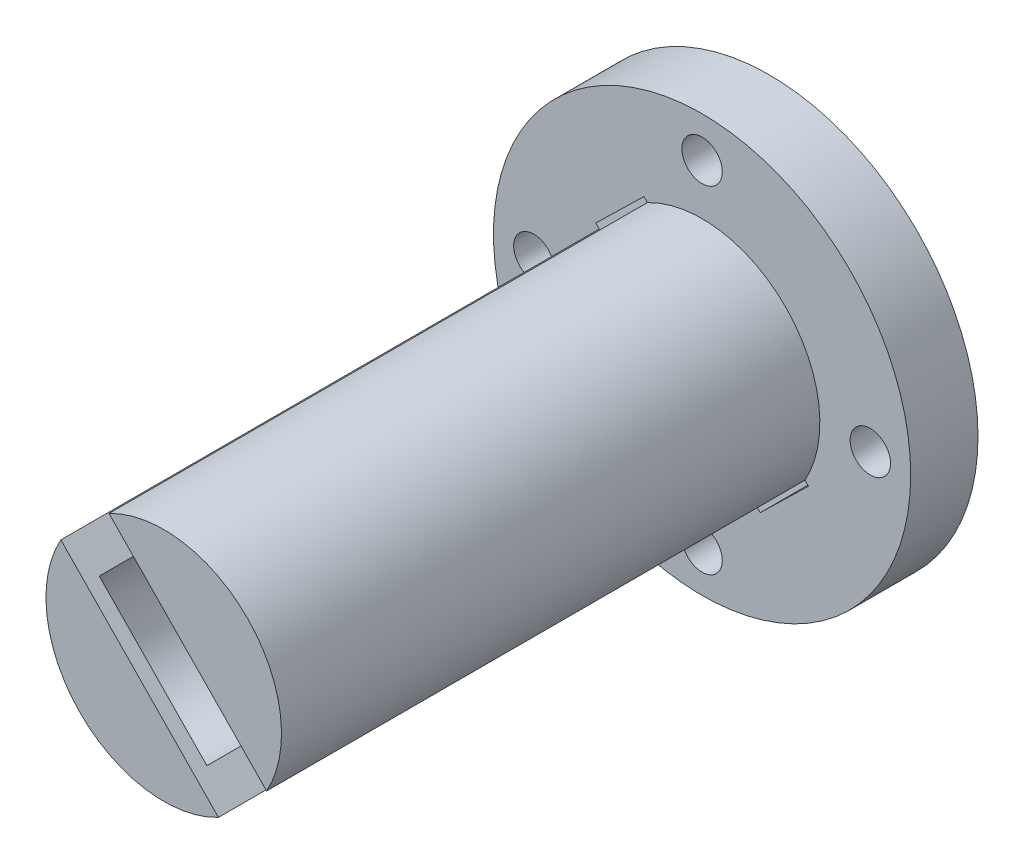
ISO-10303-21;
HEADER;
FILE_DESCRIPTION(('STEP AP214'),'2;1');
FILE_NAME('part.step','',(''),(''),'','','');
FILE_SCHEMA(('AUTOMOTIVE_DESIGN { 1 0 10303 214 1 1 1 1 }'));
ENDSEC;
DATA;
#1=APPLICATION_CONTEXT('core data for automotive mechanical design processes');
#2=APPLICATION_PROTOCOL_DEFINITION('international standard','automotive_design',2000,#1);
#3=PRODUCT_CONTEXT('',#1,'mechanical');
#4=PRODUCT('Part','Part','',(#3));
#5=PRODUCT_RELATED_PRODUCT_CATEGORY('part','',(#4));
#6=PRODUCT_DEFINITION_FORMATION('','',#4);
#7=PRODUCT_DEFINITION_CONTEXT('part definition',#1,'design');
#8=PRODUCT_DEFINITION('design','',#6,#7);
#9=PRODUCT_DEFINITION_SHAPE('','',#8);
#10=(LENGTH_UNIT() NAMED_UNIT(*) SI_UNIT(.MILLI.,.METRE.));
#11=(NAMED_UNIT(*) PLANE_ANGLE_UNIT() SI_UNIT($,.RADIAN.));
#12=(NAMED_UNIT(*) SI_UNIT($,.STERADIAN.) SOLID_ANGLE_UNIT());
#13=UNCERTAINTY_MEASURE_WITH_UNIT(LENGTH_MEASURE(1.E-05),#10,'distance_accuracy_value','');
#14=(GEOMETRIC_REPRESENTATION_CONTEXT(3) GLOBAL_UNCERTAINTY_ASSIGNED_CONTEXT((#13)) GLOBAL_UNIT_ASSIGNED_CONTEXT((#10,
#11,#12)) REPRESENTATION_CONTEXT('',''));
#15=CARTESIAN_POINT('',(0.,0.,0.));
#16=DIRECTION('',(0.,0.,1.));
#17=DIRECTION('',(1.,0.,0.));
#18=AXIS2_PLACEMENT_3D('',#15,#16,#17);
#19=CARTESIAN_POINT('',(0.,0.,10.));
#20=DIRECTION('',(0.,0.,1.));
#21=DIRECTION('',(1.,0.,0.));
#22=AXIS2_PLACEMENT_3D('',#19,#20,#21);
#23=PLANE('',#22);
#24=CARTESIAN_POINT('',(0.,-25.,10.));
#25=DIRECTION('',(0.,0.,1.));
#26=DIRECTION('',(1.,0.,0.));
#27=AXIS2_PLACEMENT_3D('',#24,#25,#26);
#28=CIRCLE('',#27,3.);
#29=CARTESIAN_POINT('',(3.,-25.,10.));
#30=VERTEX_POINT('',#29);
#31=EDGE_CURVE('E207',#30,#30,#28,.T.);
#32=ORIENTED_EDGE('',*,*,#31,.F.);
#33=EDGE_LOOP('',(#32));
#34=FACE_BOUND('',#33,.T.);
#35=CARTESIAN_POINT('',(-25.,0.,10.));
#36=DIRECTION('',(0.,0.,1.));
#37=DIRECTION('',(1.,0.,0.));
#38=AXIS2_PLACEMENT_3D('',#35,#36,#37);
#39=CIRCLE('',#38,3.);
#40=CARTESIAN_POINT('',(-22.,0.,10.));
#41=VERTEX_POINT('',#40);
#42=EDGE_CURVE('E214',#41,#41,#39,.T.);
#43=ORIENTED_EDGE('',*,*,#42,.F.);
#44=EDGE_LOOP('',(#43));
#45=FACE_BOUND('',#44,.T.);
#46=CARTESIAN_POINT('',(1.74574066942157E-13,25.,10.));
#47=DIRECTION('',(0.,0.,1.));
#48=DIRECTION('',(1.,0.,0.));
#49=AXIS2_PLACEMENT_3D('',#46,#47,#48);
#50=CIRCLE('',#49,3.);
#51=CARTESIAN_POINT('',(3.00000000000017,25.,10.));
#52=VERTEX_POINT('',#51);
#53=EDGE_CURVE('E220',#52,#52,#50,.T.);
#54=ORIENTED_EDGE('',*,*,#53,.F.);
#55=EDGE_LOOP('',(#54));
#56=FACE_BOUND('',#55,.T.);
#57=CARTESIAN_POINT('',(25.,-2.61861100413235E-13,10.));
#58=DIRECTION('',(0.,0.,1.));
#59=DIRECTION('',(1.,0.,0.));
#60=AXIS2_PLACEMENT_3D('',#57,#58,#59);
#61=CIRCLE('',#60,3.);
#62=CARTESIAN_POINT('',(28.,-2.61861100413235E-13,10.));
#63=VERTEX_POINT('',#62);
#64=EDGE_CURVE('E226',#63,#63,#61,.T.);
#65=ORIENTED_EDGE('',*,*,#64,.F.);
#66=EDGE_LOOP('',(#65));
#67=FACE_BOUND('',#66,.T.);
#68=CARTESIAN_POINT('',(0.,0.,10.));
#69=DIRECTION('',(0.,0.,1.));
#70=DIRECTION('',(1.,0.,0.));
#71=AXIS2_PLACEMENT_3D('',#68,#69,#70);
#72=CIRCLE('',#71,31.);
#73=CARTESIAN_POINT('',(31.,0.,10.));
#74=VERTEX_POINT('',#73);
#75=EDGE_CURVE('E232',#74,#74,#72,.T.);
#76=ORIENTED_EDGE('',*,*,#75,.T.);
#77=EDGE_LOOP('',(#76));
#78=FACE_BOUND('',#77,.T.);
#79=DIRECTION('',(-0.715850446822266,-0.69825363427938,0.));
#80=VECTOR('',#79,1.);
#81=CARTESIAN_POINT('',(-12.2194385998892,12.5273828193897,10.));
#82=LINE('',#81,#80);
#83=CARTESIAN_POINT('',(-8.64018636577786,16.0186509907866,10.));
#84=VERTEX_POINT('',#83);
#85=CARTESIAN_POINT('',(-15.7986908340005,9.03611464799276,10.));
#86=VERTEX_POINT('',#85);
#87=EDGE_CURVE('E189',#84,#86,#82,.T.);
#88=ORIENTED_EDGE('',*,*,#87,.F.);
#89=DIRECTION('',(0.698253634279381,-0.715850446822265,0.));
#90=VECTOR('',#89,1.);
#91=CARTESIAN_POINT('',(3.57925223411133,3.4912681713969,10.));
#92=LINE('',#91,#90);
#93=CARTESIAN_POINT('',(-8.13081720427597,15.4964451275333,9.99999999999999));
#94=VERTEX_POINT('',#93);
#95=EDGE_CURVE('E188',#84,#94,#92,.T.);
#96=ORIENTED_EDGE('',*,*,#95,.T.);
#97=CARTESIAN_POINT('',(0.,0.,9.99999999999999));
#98=DIRECTION('',(0.,0.,1.));
#99=DIRECTION('',(1.,0.,0.));
#100=AXIS2_PLACEMENT_3D('',#97,#98,#99);
#101=CIRCLE('',#100,17.5);
#102=CARTESIAN_POINT('',(15.2893216724986,-8.51390878473947,9.99999999999999));
#103=VERTEX_POINT('',#102);
#104=EDGE_CURVE('E203',#94,#103,#101,.F.);
#105=ORIENTED_EDGE('',*,*,#104,.T.);
#106=CARTESIAN_POINT('',(15.7986908340005,-9.03611464799273,10.));
#107=VERTEX_POINT('',#106);
#108=EDGE_CURVE('E186',#103,#107,#92,.T.);
#109=ORIENTED_EDGE('',*,*,#108,.T.);
#110=DIRECTION('',(-0.715850446822265,-0.698253634279381,0.));
#111=VECTOR('',#110,1.);
#112=CARTESIAN_POINT('',(12.2194385998892,-12.5273828193896,10.));
#113=LINE('',#112,#111);
#114=CARTESIAN_POINT('',(8.64018636577783,-16.0186509907865,10.));
#115=VERTEX_POINT('',#114);
#116=EDGE_CURVE('E131',#107,#115,#113,.T.);
#117=ORIENTED_EDGE('',*,*,#116,.T.);
#118=DIRECTION('',(0.698253634279381,-0.715850446822265,0.));
#119=VECTOR('',#118,1.);
#120=CARTESIAN_POINT('',(-3.57925223411133,-3.4912681713969,10.));
#121=LINE('',#120,#119);
#122=CARTESIAN_POINT('',(8.13081720427597,-15.4964451275333,9.99999999999999));
#123=VERTEX_POINT('',#122);
#124=EDGE_CURVE('E171',#123,#115,#121,.T.);
#125=ORIENTED_EDGE('',*,*,#124,.F.);
#126=CARTESIAN_POINT('',(-15.2893216724986,8.51390878473947,9.99999999999999));
#127=VERTEX_POINT('',#126);
#128=EDGE_CURVE('E206',#123,#127,#101,.F.);
#129=ORIENTED_EDGE('',*,*,#128,.T.);
#130=EDGE_CURVE('E174',#86,#127,#121,.T.);
#131=ORIENTED_EDGE('',*,*,#130,.F.);
#132=EDGE_LOOP('',(#88,#96,#105,#109,#117,#125,#129,#131));
#133=FACE_BOUND('',#132,.T.);
#134=ADVANCED_FACE('F37',(#34,#45,#56,#67,#78,#133),#23,.T.);
#135=CARTESIAN_POINT('',(0.,0.,0.));
#136=DIRECTION('',(0.,0.,1.));
#137=DIRECTION('',(1.,0.,0.));
#138=AXIS2_PLACEMENT_3D('',#135,#136,#137);
#139=PLANE('',#138);
#140=CARTESIAN_POINT('',(0.,-25.,0.));
#141=DIRECTION('',(0.,0.,1.));
#142=DIRECTION('',(1.,0.,0.));
#143=AXIS2_PLACEMENT_3D('',#140,#141,#142);
#144=CIRCLE('',#143,3.);
#145=CARTESIAN_POINT('',(3.,-25.,0.));
#146=VERTEX_POINT('',#145);
#147=EDGE_CURVE('E211',#146,#146,#144,.T.);
#148=ORIENTED_EDGE('',*,*,#147,.T.);
#149=EDGE_LOOP('',(#148));
#150=FACE_BOUND('',#149,.T.);
#151=CARTESIAN_POINT('',(-25.,0.,0.));
#152=DIRECTION('',(0.,0.,1.));
#153=DIRECTION('',(1.,0.,0.));
#154=AXIS2_PLACEMENT_3D('',#151,#152,#153);
#155=CIRCLE('',#154,3.);
#156=CARTESIAN_POINT('',(-22.,0.,0.));
#157=VERTEX_POINT('',#156);
#158=EDGE_CURVE('E217',#157,#157,#155,.T.);
#159=ORIENTED_EDGE('',*,*,#158,.T.);
#160=EDGE_LOOP('',(#159));
#161=FACE_BOUND('',#160,.T.);
#162=CARTESIAN_POINT('',(1.74574066942157E-13,25.,0.));
#163=DIRECTION('',(0.,0.,1.));
#164=DIRECTION('',(1.,0.,0.));
#165=AXIS2_PLACEMENT_3D('',#162,#163,#164);
#166=CIRCLE('',#165,3.);
#167=CARTESIAN_POINT('',(3.00000000000017,25.,0.));
#168=VERTEX_POINT('',#167);
#169=EDGE_CURVE('E223',#168,#168,#166,.T.);
#170=ORIENTED_EDGE('',*,*,#169,.T.);
#171=EDGE_LOOP('',(#170));
#172=FACE_BOUND('',#171,.T.);
#173=CARTESIAN_POINT('',(25.,-2.61861100413235E-13,0.));
#174=DIRECTION('',(0.,0.,1.));
#175=DIRECTION('',(1.,0.,0.));
#176=AXIS2_PLACEMENT_3D('',#173,#174,#175);
#177=CIRCLE('',#176,3.);
#178=CARTESIAN_POINT('',(28.,-2.61861100413235E-13,0.));
#179=VERTEX_POINT('',#178);
#180=EDGE_CURVE('E229',#179,#179,#177,.T.);
#181=ORIENTED_EDGE('',*,*,#180,.T.);
#182=EDGE_LOOP('',(#181));
#183=FACE_BOUND('',#182,.T.);
#184=CARTESIAN_POINT('',(0.,0.,0.));
#185=DIRECTION('',(0.,0.,1.));
#186=DIRECTION('',(1.,0.,0.));
#187=AXIS2_PLACEMENT_3D('',#184,#185,#186);
#188=CIRCLE('',#187,31.);
#189=CARTESIAN_POINT('',(31.,0.,0.));
#190=VERTEX_POINT('',#189);
#191=EDGE_CURVE('E210',#190,#190,#188,.T.);
#192=ORIENTED_EDGE('',*,*,#191,.F.);
#193=EDGE_LOOP('',(#192));
#194=FACE_BOUND('',#193,.T.);
#195=DIRECTION('',(-0.698253634279381,0.715850446822265,0.));
#196=VECTOR('',#195,1.);
#197=CARTESIAN_POINT('',(15.7986908340005,-9.03611464799273,0.));
#198=LINE('',#197,#196);
#199=CARTESIAN_POINT('',(-4.42024809929686,11.6923653184744,0.));
#200=VERTEX_POINT('',#199);
#201=CARTESIAN_POINT('',(-8.64018636577786,16.0186509907866,0.));
#202=VERTEX_POINT('',#201);
#203=EDGE_CURVE('E145',#200,#202,#198,.T.);
#204=ORIENTED_EDGE('',*,*,#203,.T.);
#205=DIRECTION('',(0.715850446822266,0.69825363427938,0.));
#206=VECTOR('',#205,1.);
#207=CARTESIAN_POINT('',(-15.7986908340005,9.03611464799276,0.));
#208=LINE('',#207,#206);
#209=CARTESIAN_POINT('',(-15.7986908340005,9.03611464799276,0.));
#210=VERTEX_POINT('',#209);
#211=EDGE_CURVE('E144',#210,#202,#208,.T.);
#212=ORIENTED_EDGE('',*,*,#211,.F.);
#213=DIRECTION('',(-0.698253634279381,0.715850446822265,0.));
#214=VECTOR('',#213,1.);
#215=CARTESIAN_POINT('',(8.64018636577783,-16.0186509907865,0.));
#216=LINE('',#215,#214);
#217=CARTESIAN_POINT('',(-11.5787525675195,4.70982897568057,0.));
#218=VERTEX_POINT('',#217);
#219=EDGE_CURVE('E155',#218,#210,#216,.T.);
#220=ORIENTED_EDGE('',*,*,#219,.F.);
#221=CARTESIAN_POINT('',(0.,0.,0.));
#222=DIRECTION('',(0.,0.,1.));
#223=DIRECTION('',(1.,0.,0.));
#224=AXIS2_PLACEMENT_3D('',#221,#222,#223);
#225=CIRCLE('',#224,12.5);
#226=CARTESIAN_POINT('',(4.42024809929686,-11.6923653184744,0.));
#227=VERTEX_POINT('',#226);
#228=EDGE_CURVE('E197',#218,#227,#225,.T.);
#229=ORIENTED_EDGE('',*,*,#228,.T.);
#230=CARTESIAN_POINT('',(8.64018636577783,-16.0186509907865,0.));
#231=VERTEX_POINT('',#230);
#232=EDGE_CURVE('E150',#231,#227,#216,.T.);
#233=ORIENTED_EDGE('',*,*,#232,.F.);
#234=DIRECTION('',(0.715850446822265,0.698253634279381,0.));
#235=VECTOR('',#234,1.);
#236=CARTESIAN_POINT('',(8.64018636577783,-16.0186509907865,0.));
#237=LINE('',#236,#235);
#238=CARTESIAN_POINT('',(15.7986908340005,-9.03611464799273,0.));
#239=VERTEX_POINT('',#238);
#240=EDGE_CURVE('E129',#231,#239,#237,.T.);
#241=ORIENTED_EDGE('',*,*,#240,.T.);
#242=CARTESIAN_POINT('',(11.5787525675195,-4.70982897568057,0.));
#243=VERTEX_POINT('',#242);
#244=EDGE_CURVE('E137',#239,#243,#198,.T.);
#245=ORIENTED_EDGE('',*,*,#244,.T.);
#246=EDGE_CURVE('E192',#243,#200,#225,.T.);
#247=ORIENTED_EDGE('',*,*,#246,.T.);
#248=EDGE_LOOP('',(#204,#212,#220,#229,#233,#241,#245,#247));
#249=FACE_BOUND('',#248,.T.);
#250=ADVANCED_FACE('F148',(#150,#161,#172,#183,#194,#249),#139,.F.);
#251=CARTESIAN_POINT('',(0.,0.,90.));
#252=DIRECTION('',(0.,0.,-1.));
#253=DIRECTION('',(-1.,0.,0.));
#254=AXIS2_PLACEMENT_3D('',#251,#252,#253);
#255=CYLINDRICAL_SURFACE('',#254,17.5);
#256=DIRECTION('',(0.,0.,-1.));
#257=VECTOR('',#256,1.);
#258=CARTESIAN_POINT('',(-8.13081720427597,15.4964451275333,90.));
#259=LINE('',#258,#257);
#260=CARTESIAN_POINT('',(-8.13081720427598,15.4964451275333,90.));
#261=VERTEX_POINT('',#260);
#262=EDGE_CURVE('E184',#261,#94,#259,.T.);
#263=ORIENTED_EDGE('',*,*,#262,.F.);
#264=CARTESIAN_POINT('',(0.,0.,90.));
#265=DIRECTION('',(0.,0.,1.));
#266=DIRECTION('',(1.,0.,0.));
#267=AXIS2_PLACEMENT_3D('',#264,#265,#266);
#268=CIRCLE('',#267,17.5);
#269=CARTESIAN_POINT('',(15.2893216724986,-8.51390878473947,90.));
#270=VERTEX_POINT('',#269);
#271=EDGE_CURVE('E199',#270,#261,#268,.T.);
#272=ORIENTED_EDGE('',*,*,#271,.F.);
#273=DIRECTION('',(0.,0.,-1.));
#274=VECTOR('',#273,1.);
#275=CARTESIAN_POINT('',(15.2893216724986,-8.51390878473947,90.));
#276=LINE('',#275,#274);
#277=EDGE_CURVE('E182',#103,#270,#276,.F.);
#278=ORIENTED_EDGE('',*,*,#277,.F.);
#279=ORIENTED_EDGE('',*,*,#104,.F.);
#280=EDGE_LOOP('',(#263,#272,#278,#279));
#281=FACE_BOUND('',#280,.T.);
#282=ADVANCED_FACE('F276',(#281),#255,.T.);
#283=CARTESIAN_POINT('',(0.,0.,90.));
#284=DIRECTION('',(0.,0.,1.));
#285=DIRECTION('',(1.,0.,0.));
#286=AXIS2_PLACEMENT_3D('',#283,#284,#285);
#287=PLANE('',#286);
#288=ORIENTED_EDGE('',*,*,#271,.T.);
#289=DIRECTION('',(0.698253634279381,-0.715850446822265,0.));
#290=VECTOR('',#289,1.);
#291=CARTESIAN_POINT('',(3.57925223411133,3.4912681713969,90.));
#292=LINE('',#291,#290);
#293=EDGE_CURVE('E179',#261,#270,#292,.T.);
#294=ORIENTED_EDGE('',*,*,#293,.T.);
#295=EDGE_LOOP('',(#288,#294));
#296=FACE_BOUND('',#295,.T.);
#297=ADVANCED_FACE('F267',(#296),#287,.T.);
#298=CARTESIAN_POINT('',(0.,0.,88.));
#299=DIRECTION('',(0.,0.,-1.));
#300=DIRECTION('',(-1.,0.,0.));
#301=AXIS2_PLACEMENT_3D('',#298,#299,#300);
#302=CYLINDRICAL_SURFACE('',#301,12.5);
#303=CARTESIAN_POINT('',(0.,0.,88.));
#304=DIRECTION('',(0.,0.,1.));
#305=DIRECTION('',(1.,0.,0.));
#306=AXIS2_PLACEMENT_3D('',#303,#304,#305);
#307=CIRCLE('',#306,12.5);
#308=CARTESIAN_POINT('',(11.5787525675195,-4.70982897568057,88.));
#309=VERTEX_POINT('',#308);
#310=CARTESIAN_POINT('',(-4.42024809929686,11.6923653184744,88.));
#311=VERTEX_POINT('',#310);
#312=EDGE_CURVE('E193',#309,#311,#307,.T.);
#313=ORIENTED_EDGE('',*,*,#312,.T.);
#314=DIRECTION('',(0.,0.,-1.));
#315=VECTOR('',#314,1.);
#316=CARTESIAN_POINT('',(-4.42024809929686,11.6923653184744,88.));
#317=LINE('',#316,#315);
#318=EDGE_CURVE('E176',#311,#200,#317,.T.);
#319=ORIENTED_EDGE('',*,*,#318,.T.);
#320=ORIENTED_EDGE('',*,*,#246,.F.);
#321=DIRECTION('',(0.,0.,-1.));
#322=VECTOR('',#321,1.);
#323=CARTESIAN_POINT('',(11.5787525675195,-4.70982897568057,88.));
#324=LINE('',#323,#322);
#325=EDGE_CURVE('E140',#243,#309,#324,.F.);
#326=ORIENTED_EDGE('',*,*,#325,.T.);
#327=EDGE_LOOP('',(#313,#319,#320,#326));
#328=FACE_BOUND('',#327,.T.);
#329=ADVANCED_FACE('F273',(#328),#302,.F.);
#330=CARTESIAN_POINT('',(0.,0.,88.));
#331=DIRECTION('',(0.,0.,1.));
#332=DIRECTION('',(1.,0.,0.));
#333=AXIS2_PLACEMENT_3D('',#330,#331,#332);
#334=PLANE('',#333);
#335=DIRECTION('',(0.698253634279381,-0.715850446822265,0.));
#336=VECTOR('',#335,1.);
#337=CARTESIAN_POINT('',(3.57925223411133,3.4912681713969,88.));
#338=LINE('',#337,#336);
#339=EDGE_CURVE('E11',#311,#309,#338,.T.);
#340=ORIENTED_EDGE('',*,*,#339,.F.);
#341=ORIENTED_EDGE('',*,*,#312,.F.);
#342=EDGE_LOOP('',(#340,#341));
#343=FACE_BOUND('',#342,.T.);
#344=ADVANCED_FACE('F317',(#343),#334,.F.);
#345=CARTESIAN_POINT('',(0.,0.,10.));
#346=DIRECTION('',(0.,0.,-1.));
#347=DIRECTION('',(-1.,0.,0.));
#348=AXIS2_PLACEMENT_3D('',#345,#346,#347);
#349=CYLINDRICAL_SURFACE('',#348,31.);
#350=ORIENTED_EDGE('',*,*,#75,.F.);
#351=EDGE_LOOP('',(#350));
#352=FACE_BOUND('',#351,.T.);
#353=ORIENTED_EDGE('',*,*,#191,.T.);
#354=EDGE_LOOP('',(#353));
#355=FACE_BOUND('',#354,.T.);
#356=ADVANCED_FACE('F39',(#352,#355),#349,.T.);
#357=CARTESIAN_POINT('',(25.,-2.61861100413235E-13,10.));
#358=DIRECTION('',(0.,0.,-1.));
#359=DIRECTION('',(-1.,0.,0.));
#360=AXIS2_PLACEMENT_3D('',#357,#358,#359);
#361=CYLINDRICAL_SURFACE('',#360,3.);
#362=ORIENTED_EDGE('',*,*,#64,.T.);
#363=EDGE_LOOP('',(#362));
#364=FACE_BOUND('',#363,.T.);
#365=ORIENTED_EDGE('',*,*,#180,.F.);
#366=EDGE_LOOP('',(#365));
#367=FACE_BOUND('',#366,.T.);
#368=ADVANCED_FACE('F289',(#364,#367),#361,.F.);
#369=CARTESIAN_POINT('',(1.74574066942157E-13,25.,10.));
#370=DIRECTION('',(0.,0.,-1.));
#371=DIRECTION('',(-1.,0.,0.));
#372=AXIS2_PLACEMENT_3D('',#369,#370,#371);
#373=CYLINDRICAL_SURFACE('',#372,3.);
#374=ORIENTED_EDGE('',*,*,#53,.T.);
#375=EDGE_LOOP('',(#374));
#376=FACE_BOUND('',#375,.T.);
#377=ORIENTED_EDGE('',*,*,#169,.F.);
#378=EDGE_LOOP('',(#377));
#379=FACE_BOUND('',#378,.T.);
#380=ADVANCED_FACE('F292',(#376,#379),#373,.F.);
#381=CARTESIAN_POINT('',(-25.,0.,10.));
#382=DIRECTION('',(0.,0.,-1.));
#383=DIRECTION('',(-1.,0.,0.));
#384=AXIS2_PLACEMENT_3D('',#381,#382,#383);
#385=CYLINDRICAL_SURFACE('',#384,3.);
#386=ORIENTED_EDGE('',*,*,#42,.T.);
#387=EDGE_LOOP('',(#386));
#388=FACE_BOUND('',#387,.T.);
#389=ORIENTED_EDGE('',*,*,#158,.F.);
#390=EDGE_LOOP('',(#389));
#391=FACE_BOUND('',#390,.T.);
#392=ADVANCED_FACE('F296',(#388,#391),#385,.F.);
#393=CARTESIAN_POINT('',(0.,-25.,10.));
#394=DIRECTION('',(0.,0.,-1.));
#395=DIRECTION('',(-1.,0.,0.));
#396=AXIS2_PLACEMENT_3D('',#393,#394,#395);
#397=CYLINDRICAL_SURFACE('',#396,3.);
#398=ORIENTED_EDGE('',*,*,#31,.T.);
#399=EDGE_LOOP('',(#398));
#400=FACE_BOUND('',#399,.T.);
#401=ORIENTED_EDGE('',*,*,#147,.F.);
#402=EDGE_LOOP('',(#401));
#403=FACE_BOUND('',#402,.T.);
#404=ADVANCED_FACE('F274',(#400,#403),#397,.F.);
#405=CARTESIAN_POINT('',(-15.2893216724986,8.51390878473947,90.));
#406=VERTEX_POINT('',#405);
#407=CARTESIAN_POINT('',(8.13081720427597,-15.4964451275333,90.));
#408=VERTEX_POINT('',#407);
#409=EDGE_CURVE('E202',#406,#408,#268,.T.);
#410=ORIENTED_EDGE('',*,*,#409,.F.);
#411=DIRECTION('',(0.,0.,-1.));
#412=VECTOR('',#411,1.);
#413=CARTESIAN_POINT('',(-15.2893216724986,8.51390878473947,90.));
#414=LINE('',#413,#412);
#415=EDGE_CURVE('E52',#406,#127,#414,.T.);
#416=ORIENTED_EDGE('',*,*,#415,.T.);
#417=ORIENTED_EDGE('',*,*,#128,.F.);
#418=DIRECTION('',(0.,0.,-1.));
#419=VECTOR('',#418,1.);
#420=CARTESIAN_POINT('',(8.13081720427597,-15.4964451275333,90.));
#421=LINE('',#420,#419);
#422=EDGE_CURVE('E167',#123,#408,#421,.F.);
#423=ORIENTED_EDGE('',*,*,#422,.T.);
#424=EDGE_LOOP('',(#410,#416,#417,#423));
#425=FACE_BOUND('',#424,.T.);
#426=ADVANCED_FACE('F261',(#425),#255,.T.);
#427=DIRECTION('',(0.698253634279381,-0.715850446822265,0.));
#428=VECTOR('',#427,1.);
#429=CARTESIAN_POINT('',(-3.57925223411133,-3.4912681713969,90.));
#430=LINE('',#429,#428);
#431=EDGE_CURVE('E165',#406,#408,#430,.T.);
#432=ORIENTED_EDGE('',*,*,#431,.F.);
#433=ORIENTED_EDGE('',*,*,#409,.T.);
#434=EDGE_LOOP('',(#432,#433));
#435=FACE_BOUND('',#434,.T.);
#436=ADVANCED_FACE('F264',(#435),#287,.T.);
#437=DIRECTION('',(0.,0.,-1.));
#438=VECTOR('',#437,1.);
#439=CARTESIAN_POINT('',(-11.5787525675195,4.70982897568057,88.));
#440=LINE('',#439,#438);
#441=CARTESIAN_POINT('',(-11.5787525675195,4.70982897568057,88.));
#442=VERTEX_POINT('',#441);
#443=EDGE_CURVE('E163',#442,#218,#440,.T.);
#444=ORIENTED_EDGE('',*,*,#443,.F.);
#445=CARTESIAN_POINT('',(4.42024809929686,-11.6923653184744,88.));
#446=VERTEX_POINT('',#445);
#447=EDGE_CURVE('E196',#442,#446,#307,.T.);
#448=ORIENTED_EDGE('',*,*,#447,.T.);
#449=DIRECTION('',(0.,0.,-1.));
#450=VECTOR('',#449,1.);
#451=CARTESIAN_POINT('',(4.42024809929686,-11.6923653184744,88.));
#452=LINE('',#451,#450);
#453=EDGE_CURVE('E59',#227,#446,#452,.F.);
#454=ORIENTED_EDGE('',*,*,#453,.F.);
#455=ORIENTED_EDGE('',*,*,#228,.F.);
#456=EDGE_LOOP('',(#444,#448,#454,#455));
#457=FACE_BOUND('',#456,.T.);
#458=ADVANCED_FACE('F242',(#457),#302,.F.);
#459=ORIENTED_EDGE('',*,*,#447,.F.);
#460=DIRECTION('',(0.698253634279381,-0.715850446822265,0.));
#461=VECTOR('',#460,1.);
#462=CARTESIAN_POINT('',(-3.57925223411133,-3.4912681713969,88.));
#463=LINE('',#462,#461);
#464=EDGE_CURVE('E45',#442,#446,#463,.T.);
#465=ORIENTED_EDGE('',*,*,#464,.T.);
#466=EDGE_LOOP('',(#459,#465));
#467=FACE_BOUND('',#466,.T.);
#468=ADVANCED_FACE('F239',(#467),#334,.F.);
#469=CARTESIAN_POINT('',(8.64018636577783,-16.0186509907865,120.));
#470=DIRECTION('',(-0.698253634279381,0.715850446822265,0.));
#471=DIRECTION('',(-0.715850446822265,-0.698253634279381,0.));
#472=AXIS2_PLACEMENT_3D('',#469,#470,#471);
#473=PLANE('',#472);
#474=DIRECTION('',(0.,0.,-1.));
#475=VECTOR('',#474,1.);
#476=CARTESIAN_POINT('',(15.7986908340005,-9.03611464799273,120.));
#477=LINE('',#476,#475);
#478=EDGE_CURVE('E124',#107,#239,#477,.T.);
#479=ORIENTED_EDGE('',*,*,#478,.T.);
#480=ORIENTED_EDGE('',*,*,#240,.F.);
#481=DIRECTION('',(0.,0.,-1.));
#482=VECTOR('',#481,1.);
#483=CARTESIAN_POINT('',(8.64018636577783,-16.0186509907865,120.));
#484=LINE('',#483,#482);
#485=EDGE_CURVE('E157',#115,#231,#484,.T.);
#486=ORIENTED_EDGE('',*,*,#485,.F.);
#487=ORIENTED_EDGE('',*,*,#116,.F.);
#488=EDGE_LOOP('',(#479,#480,#486,#487));
#489=FACE_BOUND('',#488,.T.);
#490=ADVANCED_FACE('F126',(#489),#473,.T.);
#491=CARTESIAN_POINT('',(15.7986908340005,-9.03611464799273,120.));
#492=DIRECTION('',(-0.715850446822265,-0.698253634279381,0.));
#493=DIRECTION('',(0.698253634279381,-0.715850446822265,0.));
#494=AXIS2_PLACEMENT_3D('',#491,#492,#493);
#495=PLANE('',#494);
#496=DIRECTION('',(0.,0.,-1.));
#497=VECTOR('',#496,1.);
#498=CARTESIAN_POINT('',(-8.64018636577786,16.0186509907866,120.));
#499=LINE('',#498,#497);
#500=EDGE_CURVE('E134',#84,#202,#499,.T.);
#501=ORIENTED_EDGE('',*,*,#500,.T.);
#502=ORIENTED_EDGE('',*,*,#203,.F.);
#503=ORIENTED_EDGE('',*,*,#318,.F.);
#504=ORIENTED_EDGE('',*,*,#339,.T.);
#505=ORIENTED_EDGE('',*,*,#325,.F.);
#506=ORIENTED_EDGE('',*,*,#244,.F.);
#507=ORIENTED_EDGE('',*,*,#478,.F.);
#508=ORIENTED_EDGE('',*,*,#108,.F.);
#509=ORIENTED_EDGE('',*,*,#277,.T.);
#510=ORIENTED_EDGE('',*,*,#293,.F.);
#511=ORIENTED_EDGE('',*,*,#262,.T.);
#512=ORIENTED_EDGE('',*,*,#95,.F.);
#513=EDGE_LOOP('',(#501,#502,#503,#504,#505,#506,#507,#508,#509,#510,#511,#512));
#514=FACE_BOUND('',#513,.T.);
#515=ADVANCED_FACE('F138',(#514),#495,.T.);
#516=CARTESIAN_POINT('',(-15.7986908340005,9.03611464799276,120.));
#517=DIRECTION('',(-0.69825363427938,0.715850446822265,0.));
#518=DIRECTION('',(-0.715850446822266,-0.69825363427938,0.));
#519=AXIS2_PLACEMENT_3D('',#516,#517,#518);
#520=PLANE('',#519);
#521=ORIENTED_EDGE('',*,*,#87,.T.);
#522=DIRECTION('',(0.,0.,-1.));
#523=VECTOR('',#522,1.);
#524=CARTESIAN_POINT('',(-15.7986908340005,9.03611464799276,120.));
#525=LINE('',#524,#523);
#526=EDGE_CURVE('E159',#86,#210,#525,.T.);
#527=ORIENTED_EDGE('',*,*,#526,.T.);
#528=ORIENTED_EDGE('',*,*,#211,.T.);
#529=ORIENTED_EDGE('',*,*,#500,.F.);
#530=EDGE_LOOP('',(#521,#527,#528,#529));
#531=FACE_BOUND('',#530,.T.);
#532=ADVANCED_FACE('F251',(#531),#520,.F.);
#533=CARTESIAN_POINT('',(8.64018636577783,-16.0186509907865,120.));
#534=DIRECTION('',(-0.715850446822265,-0.698253634279381,0.));
#535=DIRECTION('',(0.698253634279381,-0.715850446822265,0.));
#536=AXIS2_PLACEMENT_3D('',#533,#534,#535);
#537=PLANE('',#536);
#538=ORIENTED_EDGE('',*,*,#130,.T.);
#539=ORIENTED_EDGE('',*,*,#415,.F.);
#540=ORIENTED_EDGE('',*,*,#431,.T.);
#541=ORIENTED_EDGE('',*,*,#422,.F.);
#542=ORIENTED_EDGE('',*,*,#124,.T.);
#543=ORIENTED_EDGE('',*,*,#485,.T.);
#544=ORIENTED_EDGE('',*,*,#232,.T.);
#545=ORIENTED_EDGE('',*,*,#453,.T.);
#546=ORIENTED_EDGE('',*,*,#464,.F.);
#547=ORIENTED_EDGE('',*,*,#443,.T.);
#548=ORIENTED_EDGE('',*,*,#219,.T.);
#549=ORIENTED_EDGE('',*,*,#526,.F.);
#550=EDGE_LOOP('',(#538,#539,#540,#541,#542,#543,#544,#545,#546,#547,#548,#549));
#551=FACE_BOUND('',#550,.T.);
#552=ADVANCED_FACE('F246',(#551),#537,.F.);
#553=CLOSED_SHELL('',(#134,#250,#282,#297,#329,#344,#356,#368,#380,#392,#404,#426,#436,#458,
#468,#490,#515,#532,#552));
#554=MANIFOLD_SOLID_BREP('B2',#553);
#555=ADVANCED_BREP_SHAPE_REPRESENTATION('',(#18,#554),#14);
#556=SHAPE_DEFINITION_REPRESENTATION(#9,#555);
ENDSEC;
END-ISO-10303-21;
